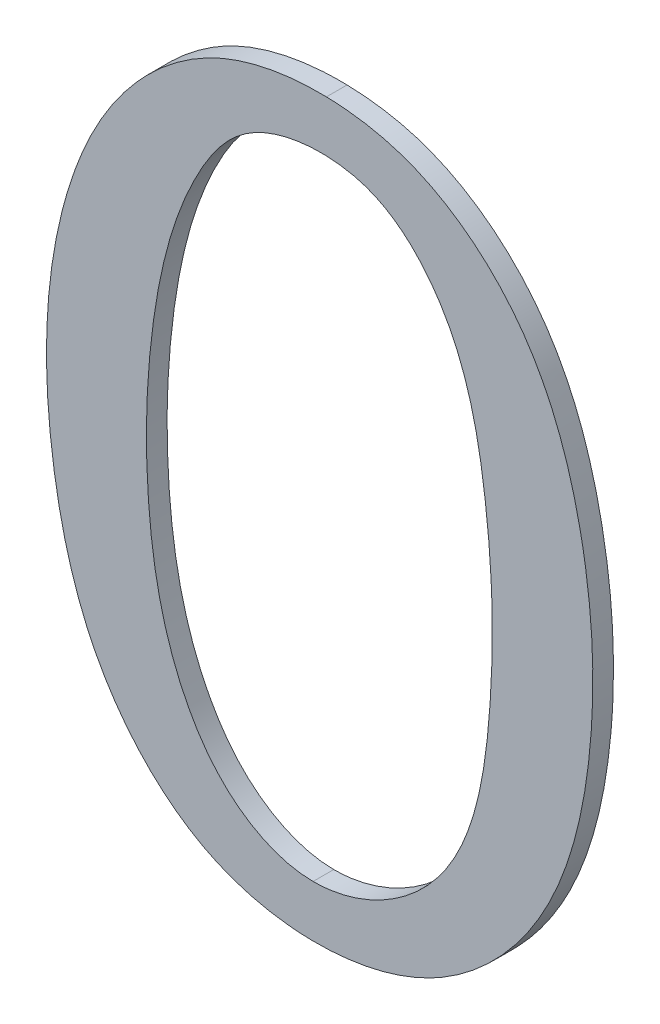
ISO-10303-21;
HEADER;
FILE_DESCRIPTION(('STEP AP214'),'2;1');
FILE_NAME('part.step','',(''),(''),'','','');
FILE_SCHEMA(('AUTOMOTIVE_DESIGN { 1 0 10303 214 1 1 1 1 }'));
ENDSEC;
DATA;
#1=APPLICATION_CONTEXT('core data for automotive mechanical design processes');
#2=APPLICATION_PROTOCOL_DEFINITION('international standard','automotive_design',2000,#1);
#3=PRODUCT_CONTEXT('',#1,'mechanical');
#4=PRODUCT('Part','Part','',(#3));
#5=PRODUCT_RELATED_PRODUCT_CATEGORY('part','',(#4));
#6=PRODUCT_DEFINITION_FORMATION('','',#4);
#7=PRODUCT_DEFINITION_CONTEXT('part definition',#1,'design');
#8=PRODUCT_DEFINITION('design','',#6,#7);
#9=PRODUCT_DEFINITION_SHAPE('','',#8);
#10=(LENGTH_UNIT() NAMED_UNIT(*) SI_UNIT(.MILLI.,.METRE.));
#11=(NAMED_UNIT(*) PLANE_ANGLE_UNIT() SI_UNIT($,.RADIAN.));
#12=(NAMED_UNIT(*) SI_UNIT($,.STERADIAN.) SOLID_ANGLE_UNIT());
#13=UNCERTAINTY_MEASURE_WITH_UNIT(LENGTH_MEASURE(1.E-05),#10,'distance_accuracy_value','');
#14=(GEOMETRIC_REPRESENTATION_CONTEXT(3) GLOBAL_UNCERTAINTY_ASSIGNED_CONTEXT((#13)) GLOBAL_UNIT_ASSIGNED_CONTEXT((#10,
#11,#12)) REPRESENTATION_CONTEXT('',''));
#15=CARTESIAN_POINT('',(0.,0.,0.));
#16=DIRECTION('',(0.,0.,1.));
#17=DIRECTION('',(1.,0.,0.));
#18=AXIS2_PLACEMENT_3D('',#15,#16,#17);
#19=CARTESIAN_POINT('',(0.,0.,0.));
#20=DIRECTION('',(0.,0.,1.));
#21=DIRECTION('',(1.,0.,0.));
#22=AXIS2_PLACEMENT_3D('',#19,#20,#21);
#23=PLANE('',#22);
#24=CARTESIAN_POINT('',(5.34232767395602,-2.83286261609844,0.));
#25=CARTESIAN_POINT('',(5.35965250410576,-2.83339807708916,0.));
#26=CARTESIAN_POINT('',(5.37704971181507,-2.83510172528794,0.));
#27=CARTESIAN_POINT('',(5.4111990705339,-2.84122313334333,0.));
#28=CARTESIAN_POINT('',(5.42795532083175,-2.84561867790736,0.));
#29=CARTESIAN_POINT('',(5.45232899603766,-2.85456008389062,0.));
#30=CARTESIAN_POINT('',(5.46036770756896,-2.85795649626895,0.));
#31=CARTESIAN_POINT('',(5.476074589901,-2.86551998855672,0.));
#32=CARTESIAN_POINT('',(5.48374264462424,-2.86968730794178,0.));
#33=CARTESIAN_POINT('',(5.50616232965964,-2.88319161529785,0.));
#34=CARTESIAN_POINT('',(5.520317116627,-2.8935262078646,0.));
#35=CARTESIAN_POINT('',(5.5515973920405,-2.92007799868785,0.));
#36=CARTESIAN_POINT('',(5.56803540477082,-2.93708942730186,0.));
#37=CARTESIAN_POINT('',(5.59809647927283,-2.97341480721425,0.));
#38=CARTESIAN_POINT('',(5.61171579114012,-2.99273177256757,0.));
#39=CARTESIAN_POINT('',(5.64197069888521,-3.04241743211644,0.));
#40=CARTESIAN_POINT('',(5.65705076118254,-3.07373884476934,0.));
#41=CARTESIAN_POINT('',(5.67583718818536,-3.12216303274755,0.));
#42=CARTESIAN_POINT('',(5.68146792308121,-3.13857971332396,0.));
#43=CARTESIAN_POINT('',(5.69164008808122,-3.17175360809558,0.));
#44=CARTESIAN_POINT('',(5.69618133489874,-3.18851087907532,0.));
#45=CARTESIAN_POINT('',(5.70626629905123,-3.23015254175063,0.));
#46=CARTESIAN_POINT('',(5.71128117329186,-3.25516236325165,0.));
#47=CARTESIAN_POINT('',(5.71996401178217,-3.30542085830458,0.));
#48=CARTESIAN_POINT('',(5.72363092190422,-3.3306697030169,0.));
#49=CARTESIAN_POINT('',(5.7301436295079,-3.38131691025709,0.));
#50=CARTESIAN_POINT('',(5.73298796562833,-3.40671545807686,0.));
#51=CARTESIAN_POINT('',(5.73777265407456,-3.45758675585848,0.));
#52=CARTESIAN_POINT('',(5.73971338421376,-3.48305947031898,0.));
#53=CARTESIAN_POINT('',(5.74416420823476,-3.55970108365071,0.));
#54=CARTESIAN_POINT('',(5.74528518756731,-3.61095784753678,0.));
#55=CARTESIAN_POINT('',(5.74385664847435,-3.71334004951881,0.));
#56=CARTESIAN_POINT('',(5.74131227623012,-3.76446557097506,0.));
#57=CARTESIAN_POINT('',(5.73420892416731,-3.8480146863933,0.));
#58=CARTESIAN_POINT('',(5.7307089107472,-3.88052643677705,0.));
#59=CARTESIAN_POINT('',(5.7210585493977,-3.94516365138298,0.));
#60=CARTESIAN_POINT('',(5.7149105426121,-3.97728943112015,0.));
#61=CARTESIAN_POINT('',(5.69856966185276,-4.04111019566887,0.));
#62=CARTESIAN_POINT('',(5.6883131733052,-4.07278988464719,0.));
#63=CARTESIAN_POINT('',(5.66230402835909,-4.13380992027127,0.));
#64=CARTESIAN_POINT('',(5.64657362524484,-4.16315915647873,0.));
#65=CARTESIAN_POINT('',(5.61386152995419,-4.21040812792149,0.));
#66=CARTESIAN_POINT('',(5.59829617285056,-4.22928936365041,0.));
#67=CARTESIAN_POINT('',(5.56423094893627,-4.26429186894457,0.));
#68=CARTESIAN_POINT('',(5.5457231977742,-4.28040547398632,0.));
#69=CARTESIAN_POINT('',(5.50615519222243,-4.30930061848974,0.));
#70=CARTESIAN_POINT('',(5.48508577512532,-4.32206964897589,0.));
#71=CARTESIAN_POINT('',(5.44105019212628,-4.34357377291139,0.));
#72=CARTESIAN_POINT('',(5.41809255975773,-4.35232595341397,0.));
#73=CARTESIAN_POINT('',(5.38090900946093,-4.36229576696,0.));
#74=CARTESIAN_POINT('',(5.36711355095475,-4.36513467126127,0.));
#75=CARTESIAN_POINT('',(5.33922936230977,-4.36896438584067,0.));
#76=CARTESIAN_POINT('',(5.32513984886992,-4.36994937914,0.));
#77=CARTESIAN_POINT('',(5.31101387814308,-4.36987614177689,0.));
#78=B_SPLINE_CURVE_WITH_KNOTS('',3,(#24,#25,#26,#27,#28,#29,#30,#31,#32,#33,#34,#35,#36,#37,#38,
#39,#40,#41,#42,#43,#44,#45,#46,#47,#48,#49,#50,#51,#52,#53,#54,#55,#56,#57,#58,#59,#60,#61,#62,
#63,#64,#65,#66,#67,#68,#69,#70,#71,#72,#73,#74,#75,#76,#77),.UNSPECIFIED.,.F.,.F.,(4,2,2,2,2,2,
2,2,2,2,2,2,2,2,2,2,2,2,2,2,2,2,2,2,2,2,4),(0.,0.052137867624516,0.103851151586213,
0.129989069242186,0.156135120093292,0.208466340264049,0.279062544695469,0.349752072635564,
0.453409253182165,0.505450405952289,0.557500307574428,0.633963284089065,0.710485929199705,
0.787143698628143,0.863769387261464,1.01743008862034,1.17087525934468,1.2689224237519,
1.366883080074,1.4664230888628,1.56556307277849,1.638637674604,1.71191149177715,
1.78545556722667,1.85868383001286,1.90082600710375,1.94310019382734),.UNSPECIFIED.);
#79=CARTESIAN_POINT('',(5.34232767395602,-2.83286261609844,0.));
#80=VERTEX_POINT('',#79);
#81=CARTESIAN_POINT('',(5.311013878142,-4.36987614177709,0.));
#82=VERTEX_POINT('',#81);
#83=EDGE_CURVE('E138',#80,#82,#78,.T.);
#84=ORIENTED_EDGE('',*,*,#83,.F.);
#85=CARTESIAN_POINT('',(5.311013878142,-4.3698761417773,0.));
#86=CARTESIAN_POINT('',(5.30291670221246,-4.36984619367228,0.));
#87=CARTESIAN_POINT('',(5.29482338630007,-4.36944376805904,0.));
#88=CARTESIAN_POINT('',(5.27871786714708,-4.36789951209408,0.));
#89=CARTESIAN_POINT('',(5.27070557498836,-4.366758608733,0.));
#90=CARTESIAN_POINT('',(5.24697781314285,-4.36225551502085,0.));
#91=CARTESIAN_POINT('',(5.23145955605173,-4.35781232822025,0.));
#92=CARTESIAN_POINT('',(5.2014105494815,-4.34657187291025,0.));
#93=CARTESIAN_POINT('',(5.18687581888405,-4.33978487011298,0.));
#94=CARTESIAN_POINT('',(5.15888580310387,-4.32423136597145,0.));
#95=CARTESIAN_POINT('',(5.14543221299879,-4.31546183532495,0.));
#96=CARTESIAN_POINT('',(5.1176200419846,-4.29455747170972,0.));
#97=CARTESIAN_POINT('',(5.10350111742456,-4.28210350226958,0.));
#98=CARTESIAN_POINT('',(5.07719894476444,-4.25531116713174,0.));
#99=CARTESIAN_POINT('',(5.06501672058335,-4.24097181191556,0.));
#100=CARTESIAN_POINT('',(5.03437013953986,-4.20012223694831,0.));
#101=CARTESIAN_POINT('',(5.01769558737703,-4.17228076637607,0.));
#102=CARTESIAN_POINT('',(4.98861392396518,-4.11446274607157,0.));
#103=CARTESIAN_POINT('',(4.97621898657009,-4.08448039361722,0.));
#104=CARTESIAN_POINT('',(4.95652815637315,-4.02724575776886,0.));
#105=CARTESIAN_POINT('',(4.94877826757898,-4.00014687880876,0.));
#106=CARTESIAN_POINT('',(4.93568318043903,-3.94536111390727,0.));
#107=CARTESIAN_POINT('',(4.93034036048064,-3.91767367457435,0.));
#108=CARTESIAN_POINT('',(4.92158877005833,-3.86188417639266,0.));
#109=CARTESIAN_POINT('',(4.91818847702708,-3.83378084110092,0.));
#110=CARTESIAN_POINT('',(4.91284924402855,-3.77745168511571,0.));
#111=CARTESIAN_POINT('',(4.91090989585905,-3.7492259008542,0.));
#112=CARTESIAN_POINT('',(4.90767344060163,-3.67896111173154,0.));
#113=CARTESIAN_POINT('',(4.90714810323008,-3.63688419130675,0.));
#114=CARTESIAN_POINT('',(4.90902767606048,-3.55276396338984,0.));
#115=CARTESIAN_POINT('',(4.91143460742267,-3.51072069909343,0.));
#116=CARTESIAN_POINT('',(4.91721987927172,-3.44800411090417,0.));
#117=CARTESIAN_POINT('',(4.91949972523195,-3.42722458678206,0.));
#118=CARTESIAN_POINT('',(4.9247654771734,-3.38575551353774,0.));
#119=CARTESIAN_POINT('',(4.9277514345914,-3.36506597108211,0.));
#120=CARTESIAN_POINT('',(4.93795920970902,-3.30324409782523,0.));
#121=CARTESIAN_POINT('',(4.94643610425821,-3.26229598692576,0.));
#122=CARTESIAN_POINT('',(4.9640918165215,-3.19587695733548,0.));
#123=CARTESIAN_POINT('',(4.97196000827565,-3.17005827304511,0.));
#124=CARTESIAN_POINT('',(4.98986888013895,-3.11906951077831,0.));
#125=CARTESIAN_POINT('',(4.99991706875571,-3.09390201966651,0.));
#126=CARTESIAN_POINT('',(5.01676583561125,-3.05685998070211,0.));
#127=CARTESIAN_POINT('',(5.02270178564882,-3.04458969465929,0.));
#128=CARTESIAN_POINT('',(5.03517776887967,-3.02036162225824,0.));
#129=CARTESIAN_POINT('',(5.04171803245094,-3.00840395732551,0.));
#130=CARTESIAN_POINT('',(5.06251240379304,-2.97333204220982,0.));
#131=CARTESIAN_POINT('',(5.07800113193524,-2.95087327800004,0.));
#132=CARTESIAN_POINT('',(5.1067767474317,-2.91824103182998,0.));
#133=CARTESIAN_POINT('',(5.11849790972033,-2.90672927828529,0.));
#134=CARTESIAN_POINT('',(5.13753053150947,-2.89127355812206,0.));
#135=CARTESIAN_POINT('',(5.14411025442947,-2.88642703722683,0.));
#136=CARTESIAN_POINT('',(5.15772097837214,-2.87741578325302,0.));
#137=CARTESIAN_POINT('',(5.16475205036702,-2.8732511577662,0.));
#138=CARTESIAN_POINT('',(5.1863071727889,-2.86177800870462,0.));
#139=CARTESIAN_POINT('',(5.20135479116944,-2.85544141560667,0.));
#140=CARTESIAN_POINT('',(5.23230113316282,-2.84514765147505,0.));
#141=CARTESIAN_POINT('',(5.24820391777136,-2.84120317333334,0.));
#142=CARTESIAN_POINT('',(5.27722448260667,-2.83606877695639,0.));
#143=CARTESIAN_POINT('',(5.29027632996494,-2.83449019102828,0.));
#144=CARTESIAN_POINT('',(5.31633689571419,-2.832694731877,0.));
#145=CARTESIAN_POINT('',(5.32934462923345,-2.83246374184637,0.));
#146=CARTESIAN_POINT('',(5.34232767395601,-2.83286261609844,0.));
#147=B_SPLINE_CURVE_WITH_KNOTS('',3,(#85,#86,#87,#88,#89,#90,#91,#92,#93,#94,#95,#96,#97,#98,
#99,#100,#101,#102,#103,#104,#105,#106,#107,#108,#109,#110,#111,#112,#113,#114,#115,#116,#117,
#118,#119,#120,#121,#122,#123,#124,#125,#126,#127,#128,#129,#130,#131,#132,#133,#134,#135,#136,
#137,#138,#139,#140,#141,#142,#143,#144,#145,#146),.UNSPECIFIED.,.F.,.F.,(4,2,2,2,2,2,2,2,2,2,2,
2,2,2,2,2,2,2,2,2,2,2,2,2,2,2,2,2,2,2,4),(0.,0.0242782205944365,0.0485260243597884,
0.0966912248188331,0.144648086705547,0.192678727982405,0.248935764083242,0.305222444650456,
0.402023911731217,0.49909851581644,0.583522592802493,0.668029905934809,0.75290325634344,
0.83775288350734,0.963892257841661,1.09011862699897,1.15281963846279,1.21552521879754,
1.34074852929579,1.42164550325074,1.50282566183968,1.54369908562575,1.58458815608514,
1.66589460019869,1.71493291434543,1.73940989259421,1.76389072918912,1.81262025667425,
1.86160613760291,1.90097840990769,1.93993748485444),.UNSPECIFIED.);
#148=EDGE_CURVE('E71',#82,#80,#147,.T.);
#149=ORIENTED_EDGE('',*,*,#148,.F.);
#150=EDGE_LOOP('',(#84,#149));
#151=FACE_BOUND('',#150,.T.);
#152=CARTESIAN_POINT('',(5.30932134215068,-4.49477730436278,0.));
#153=CARTESIAN_POINT('',(5.27746495698278,-4.49435096279586,0.));
#154=CARTESIAN_POINT('',(5.24552896522171,-4.49158402711856,0.));
#155=CARTESIAN_POINT('',(5.1825948046107,-4.48106909508276,0.));
#156=CARTESIAN_POINT('',(5.15159421868579,-4.4733353415552,0.));
#157=CARTESIAN_POINT('',(5.10634688096876,-4.45773084679566,0.));
#158=CARTESIAN_POINT('',(5.09141348909682,-4.45182879340066,0.));
#159=CARTESIAN_POINT('',(5.06217421304207,-4.43863691701124,0.));
#160=CARTESIAN_POINT('',(5.04786824402135,-4.43134728235692,0.));
#161=CARTESIAN_POINT('',(5.00607535329526,-4.40751974109352,0.));
#162=CARTESIAN_POINT('',(4.97969343190333,-4.38901628613651,0.));
#163=CARTESIAN_POINT('',(4.9262446032902,-4.3447178174415,0.));
#164=CARTESIAN_POINT('',(4.89976749226012,-4.31822581724455,0.));
#165=CARTESIAN_POINT('',(4.85143355673646,-4.2613249849967,0.));
#166=CARTESIAN_POINT('',(4.82957905049907,-4.23091419990238,0.));
#167=CARTESIAN_POINT('',(4.79768964992027,-4.17860166210305,0.));
#168=CARTESIAN_POINT('',(4.78622467388253,-4.15755255449613,0.));
#169=CARTESIAN_POINT('',(4.76525717193682,-4.11449547136837,0.));
#170=CARTESIAN_POINT('',(4.75575498721632,-4.09248732994469,0.));
#171=CARTESIAN_POINT('',(4.73851617837803,-4.04771098519015,0.));
#172=CARTESIAN_POINT('',(4.73078585363418,-4.02494039008139,0.));
#173=CARTESIAN_POINT('',(4.71691675153425,-3.9789175476034,0.));
#174=CARTESIAN_POINT('',(4.71077847779909,-3.95566515032924,0.));
#175=CARTESIAN_POINT('',(4.70039349259138,-3.91112103015207,0.));
#176=CARTESIAN_POINT('',(4.69602100349475,-3.88985808986708,0.));
#177=CARTESIAN_POINT('',(4.68819101992742,-3.84716290618923,0.));
#178=CARTESIAN_POINT('',(4.68473375170762,-3.82573062227911,0.));
#179=CARTESIAN_POINT('',(4.6755784886361,-3.76123389614573,0.));
#180=CARTESIAN_POINT('',(4.67110090257376,-3.71798715154523,0.));
#181=CARTESIAN_POINT('',(4.66582322168683,-3.63126025034107,0.));
#182=CARTESIAN_POINT('',(4.6650234950917,-3.58778007080206,0.));
#183=CARTESIAN_POINT('',(4.66746095995977,-3.50096118495432,0.));
#184=CARTESIAN_POINT('',(4.67069384237628,-3.45762237716443,0.));
#185=CARTESIAN_POINT('',(4.67950422465183,-3.38769311288225,0.));
#186=CARTESIAN_POINT('',(4.6837434466716,-3.36093118171615,0.));
#187=CARTESIAN_POINT('',(4.69398021756146,-3.30774716438252,0.));
#188=CARTESIAN_POINT('',(4.69997812301773,-3.28132514827051,0.));
#189=CARTESIAN_POINT('',(4.72074612137933,-3.20293785077192,0.));
#190=CARTESIAN_POINT('',(4.73831482706716,-3.1516438345784,0.));
#191=CARTESIAN_POINT('',(4.77701088713393,-3.06514143627837,0.));
#192=CARTESIAN_POINT('',(4.79620613915258,-3.02907522342432,0.));
#193=CARTESIAN_POINT('',(4.84025070683379,-2.96048430103641,0.));
#194=CARTESIAN_POINT('',(4.86510041555151,-2.92795983793076,0.));
#195=CARTESIAN_POINT('',(4.91479280337211,-2.87388417319952,0.));
#196=CARTESIAN_POINT('',(4.93866222079414,-2.85143544129147,0.));
#197=CARTESIAN_POINT('',(4.98967294581522,-2.81067012702481,0.));
#198=CARTESIAN_POINT('',(5.01680518118381,-2.79234247590901,0.));
#199=CARTESIAN_POINT('',(5.05976166048695,-2.76879379417704,0.));
#200=CARTESIAN_POINT('',(5.07451141749242,-2.76158347215181,0.));
#201=CARTESIAN_POINT('',(5.10464205209066,-2.74862948160285,0.));
#202=CARTESIAN_POINT('',(5.12002303459589,-2.74288605803932,0.));
#203=CARTESIAN_POINT('',(5.1669066874104,-2.72774225091012,0.));
#204=CARTESIAN_POINT('',(5.19911045777493,-2.72044949444625,0.));
#205=CARTESIAN_POINT('',(5.25017215638491,-2.71301486344577,0.));
#206=CARTESIAN_POINT('',(5.2688147371796,-2.71114656594125,0.));
#207=CARTESIAN_POINT('',(5.3060859266874,-2.70897747609111,0.));
#208=CARTESIAN_POINT('',(5.32471401169537,-2.70866782799925,0.));
#209=CARTESIAN_POINT('',(5.343331226402,-2.70908050910889,0.));
#210=B_SPLINE_CURVE_WITH_KNOTS('',3,(#152,#153,#154,#155,#156,#157,#158,#159,#160,#161,#162,
#163,#164,#165,#166,#167,#168,#169,#170,#171,#172,#173,#174,#175,#176,#177,#178,#179,#180,#181,
#182,#183,#184,#185,#186,#187,#188,#189,#190,#191,#192,#193,#194,#195,#196,#197,#198,#199,#200,
#201,#202,#203,#204,#205,#206,#207,#208,#209),.UNSPECIFIED.,.F.,.F.,(4,2,2,2,2,2,2,2,2,2,2,2,2,
2,2,2,2,2,2,2,2,2,2,2,2,2,2,2,4),(0.,0.0956790372363705,0.19108492327995,0.239192527689201,
0.287293606975229,0.38343329689225,0.495249920259242,0.607122487880247,0.678933623747667,
0.750757231893793,0.822832360274086,0.894930260784665,0.960029403748666,1.02514462481321,
1.15542891161188,1.28572624226693,1.41588446282707,1.49711274011098,1.57835749843583,
1.74022494576417,1.86235946366376,1.98450247402837,2.08245563454828,2.1801424749548,
2.22932482330012,2.2785153793389,2.37702918687024,2.43318492417687,2.4890212395665),.UNSPECIFIED.);
#211=CARTESIAN_POINT('',(5.30932134215134,-4.49477730436292,0.));
#212=VERTEX_POINT('',#211);
#213=CARTESIAN_POINT('',(5.343331226402,-2.70908050910885,0.));
#214=VERTEX_POINT('',#213);
#215=EDGE_CURVE('E58',#212,#214,#210,.T.);
#216=ORIENTED_EDGE('',*,*,#215,.T.);
#217=CARTESIAN_POINT('',(5.343331226402,-2.7090805091088,0.));
#218=CARTESIAN_POINT('',(5.37597392774525,-2.70979193638637,0.));
#219=CARTESIAN_POINT('',(5.40874371075378,-2.71281059950533,0.));
#220=CARTESIAN_POINT('',(5.4732075037356,-2.72403713125319,0.));
#221=CARTESIAN_POINT('',(5.50490568920578,-2.73222159997853,0.));
#222=CARTESIAN_POINT('',(5.55099977737467,-2.74885956161985,0.));
#223=CARTESIAN_POINT('',(5.5661758179233,-2.75516401310623,0.));
#224=CARTESIAN_POINT('',(5.59588521226096,-2.76914157741641,0.));
#225=CARTESIAN_POINT('',(5.61041832247964,-2.77681520349557,0.));
#226=CARTESIAN_POINT('',(5.65295397443955,-2.80167524775793,0.));
#227=CARTESIAN_POINT('',(5.67989847626886,-2.82070294103465,0.));
#228=CARTESIAN_POINT('',(5.72959163984756,-2.86201572044596,0.));
#229=CARTESIAN_POINT('',(5.75245153069845,-2.88416860047614,0.));
#230=CARTESIAN_POINT('',(5.78410991581941,-2.91968858013789,0.));
#231=CARTESIAN_POINT('',(5.79422129492513,-2.93190603547688,0.));
#232=CARTESIAN_POINT('',(5.81351200999114,-2.95705612482525,0.));
#233=CARTESIAN_POINT('',(5.82269126953029,-2.96998881734031,0.));
#234=CARTESIAN_POINT('',(5.85641552764183,-3.02127720793525,0.));
#235=CARTESIAN_POINT('',(5.87756795022868,-3.06191625113113,0.));
#236=CARTESIAN_POINT('',(5.90426073385355,-3.12494323844761,0.));
#237=CARTESIAN_POINT('',(5.91233392350317,-3.14635752579339,0.));
#238=CARTESIAN_POINT('',(5.92700656222124,-3.18969870171662,0.));
#239=CARTESIAN_POINT('',(5.93360575842016,-3.21162567753619,0.));
#240=CARTESIAN_POINT('',(5.94479258817907,-3.25314196606688,0.));
#241=CARTESIAN_POINT('',(5.94952704555619,-3.272692790392,0.));
#242=CARTESIAN_POINT('',(5.95814894265935,-3.31198156133882,0.));
#243=CARTESIAN_POINT('',(5.96203624935503,-3.3317195368423,0.));
#244=CARTESIAN_POINT('',(5.97251049285066,-3.39115791554493,0.));
#245=CARTESIAN_POINT('',(5.9779077380937,-3.43107502255474,0.));
#246=CARTESIAN_POINT('',(5.98544410081129,-3.51127139098697,0.));
#247=CARTESIAN_POINT('',(5.98757835245391,-3.55155110334298,0.));
#248=CARTESIAN_POINT('',(5.98857651409187,-3.63213808323199,0.));
#249=CARTESIAN_POINT('',(5.98744160078298,-3.67244533563095,0.));
#250=CARTESIAN_POINT('',(5.9827728503376,-3.74158684611474,0.));
#251=CARTESIAN_POINT('',(5.97999920475844,-3.77047522456631,0.));
#252=CARTESIAN_POINT('',(5.97271467132332,-3.82804021701716,0.));
#253=CARTESIAN_POINT('',(5.96820369216176,-3.85671681980584,0.));
#254=CARTESIAN_POINT('',(5.95712370622989,-3.91355730198847,0.));
#255=CARTESIAN_POINT('',(5.95056328786924,-3.94172281135031,0.));
#256=CARTESIAN_POINT('',(5.93508511208833,-3.99738688657378,0.));
#257=CARTESIAN_POINT('',(5.92616852984518,-4.02488577747873,0.));
#258=CARTESIAN_POINT('',(5.90111036094807,-4.09090093234225,0.));
#259=CARTESIAN_POINT('',(5.88351854899114,-4.12888987810873,0.));
#260=CARTESIAN_POINT('',(5.84222116222749,-4.20146795596025,0.));
#261=CARTESIAN_POINT('',(5.81851094854583,-4.23605448078114,0.));
#262=CARTESIAN_POINT('',(5.76947784230932,-4.29570462780551,0.));
#263=CARTESIAN_POINT('',(5.74494122427127,-4.32141737372351,0.));
#264=CARTESIAN_POINT('',(5.69202008540271,-4.368506434169,0.));
#265=CARTESIAN_POINT('',(5.66364401413106,-4.38989202065283,0.));
#266=CARTESIAN_POINT('',(5.61840303120596,-4.41783700346917,0.));
#267=CARTESIAN_POINT('',(5.6028109001932,-4.42648847592322,0.));
#268=CARTESIAN_POINT('',(5.57085437896406,-4.44222301622757,0.));
#269=CARTESIAN_POINT('',(5.55448989607198,-4.44930589527655,0.));
#270=CARTESIAN_POINT('',(5.50447660738436,-4.46823261866415,0.));
#271=CARTESIAN_POINT('',(5.46991587632785,-4.47774973042622,0.));
#272=CARTESIAN_POINT('',(5.41411674287599,-4.48807426693424,0.));
#273=CARTESIAN_POINT('',(5.39320599567879,-4.4908516194525,0.));
#274=CARTESIAN_POINT('',(5.35130240738278,-4.49433715591504,0.));
#275=CARTESIAN_POINT('',(5.33031030896768,-4.49505420964849,0.));
#276=CARTESIAN_POINT('',(5.30932134215067,-4.49477730436305,0.));
#277=B_SPLINE_CURVE_WITH_KNOTS('',3,(#217,#218,#219,#220,#221,#222,#223,#224,#225,#226,#227,
#228,#229,#230,#231,#232,#233,#234,#235,#236,#237,#238,#239,#240,#241,#242,#243,#244,#245,#246,
#247,#248,#249,#250,#251,#252,#253,#254,#255,#256,#257,#258,#259,#260,#261,#262,#263,#264,#265,
#266,#267,#268,#269,#270,#271,#272,#273,#274,#275,#276),.UNSPECIFIED.,.F.,.F.,(4,2,2,2,2,2,2,2,
2,2,2,2,2,2,2,2,2,2,2,2,2,2,2,2,2,2,2,2,2,4),(0.,0.0981639049071688,0.195886310279702,
0.245113999266006,0.294360180899364,0.392834733948634,0.487972869232006,0.535511245648746,
0.583053516424708,0.719568862951922,0.788197611262888,0.856838124085734,0.917165908728499,
0.977503159990561,1.09820161146603,1.21907987558557,1.33991463649507,1.42693495134862,
1.51395984018068,1.60062482561993,1.6872466667358,1.8123157420149,1.93747992272407,
2.04371375269017,2.14971748322988,2.20313477453988,2.25655849184947,2.36343328909855,
2.42663111069884,2.48955644879853),.UNSPECIFIED.);
#278=EDGE_CURVE('E21',#214,#212,#277,.T.);
#279=ORIENTED_EDGE('',*,*,#278,.T.);
#280=EDGE_LOOP('',(#216,#279));
#281=FACE_BOUND('',#280,.T.);
#282=ADVANCED_FACE('F17',(#151,#281),#23,.F.);
#283=CARTESIAN_POINT('',(5.318484420163,-2.708959918614,0.));
#284=CARTESIAN_POINT('',(5.326769981109,-2.708852941025,0.));
#285=CARTESIAN_POINT('',(5.405938880114,-2.709248281172,0.));
#286=CARTESIAN_POINT('',(5.594909323519,-2.742091683031,0.));
#287=CARTESIAN_POINT('',(5.853808507774,-2.9529344706,0.));
#288=CARTESIAN_POINT('',(5.982565346785,-3.334035594528,0.));
#289=CARTESIAN_POINT('',(6.001808238156,-3.758056760647,0.));
#290=CARTESIAN_POINT('',(5.901925916774,-4.170554099048,0.));
#291=CARTESIAN_POINT('',(5.634644647054,-4.446297922852,0.));
#292=CARTESIAN_POINT('',(5.411407868027,-4.495444757753,0.));
#293=CARTESIAN_POINT('',(5.30415632821,-4.494767310763,0.));
#294=CARTESIAN_POINT('',(5.292717126077,-4.494394321429,0.));
#295=CARTESIAN_POINT('',(5.284426120858,-4.493963093199,0.));
#296=(BOUNDED_CURVE() B_SPLINE_CURVE(3,(#283,#284,#285,#286,#287,#288,#289,#290,#291,#292,#293,
#294,#295),.UNSPECIFIED.,.F.,.F.) B_SPLINE_CURVE_WITH_KNOTS((4,1,1,1,1,1,1,1,1,1,4),(0.,
0.009748419186851,0.09315231256893,0.2246422952682,0.3831163361497,0.5569760037441,
0.7276787228693,0.8740886174428,0.9865664871314,0.9902515808132,1.),
.UNSPECIFIED.) CURVE() GEOMETRIC_REPRESENTATION_ITEM() RATIONAL_B_SPLINE_CURVE((1.,1.,1.,1.,1.,
1.,1.,1.,1.,1.,1.,1.,1.)) REPRESENTATION_ITEM(''));
#297=DIRECTION('',(0.,0.,1.));
#298=VECTOR('',#297,1.);
#299=SURFACE_OF_LINEAR_EXTRUSION('',#296,#298);
#300=CARTESIAN_POINT('',(5.30932134479917,-4.49477730439887,0.05));
#301=CARTESIAN_POINT('',(5.34323144727325,-4.4952201224871,0.05));
#302=CARTESIAN_POINT('',(5.37723107599895,-4.49306392179999,0.05));
#303=CARTESIAN_POINT('',(5.4444020534631,-4.48333548852445,0.05));
#304=CARTESIAN_POINT('',(5.47757418881149,-4.47576861946337,0.05));
#305=CARTESIAN_POINT('',(5.5423274414833,-4.45494678430982,0.05));
#306=CARTESIAN_POINT('',(5.57389904588452,-4.44166145514167,0.05));
#307=CARTESIAN_POINT('',(5.63397785554225,-4.40945850947483,0.05));
#308=CARTESIAN_POINT('',(5.66248746481787,-4.39054535611487,0.05));
#309=CARTESIAN_POINT('',(5.71444292960377,-4.34960711539009,0.05));
#310=CARTESIAN_POINT('',(5.738087488319,-4.32782892692252,0.05));
#311=CARTESIAN_POINT('',(5.78213617233443,-4.28118407320183,0.05));
#312=CARTESIAN_POINT('',(5.80253776680906,-4.2563150225305,0.05));
#313=CARTESIAN_POINT('',(5.8323553740348,-4.21470087528702,0.05));
#314=CARTESIAN_POINT('',(5.84287905938639,-4.1987341119461,0.05));
#315=CARTESIAN_POINT('',(5.86266232744753,-4.16603480182207,0.05));
#316=CARTESIAN_POINT('',(5.87192185438774,-4.14930222129778,0.05));
#317=CARTESIAN_POINT('',(5.89781151527908,-4.09815992489033,0.05));
#318=CARTESIAN_POINT('',(5.91256526277769,-4.06278790930124,0.05));
#319=CARTESIAN_POINT('',(5.93566371075392,-3.99601173627653,0.05));
#320=CARTESIAN_POINT('',(5.9446402538335,-3.96481659329245,0.05));
#321=CARTESIAN_POINT('',(5.95978735828059,-3.90173041026946,0.05));
#322=CARTESIAN_POINT('',(5.96595532285429,-3.86983875466881,0.05));
#323=CARTESIAN_POINT('',(5.97594981933934,-3.80556975712407,0.05));
#324=CARTESIAN_POINT('',(5.97976659998393,-3.7731909555064,0.05));
#325=CARTESIAN_POINT('',(5.98535578638688,-3.70827295010024,0.05));
#326=CARTESIAN_POINT('',(5.98712903387282,-3.6757338179021,0.05));
#327=CARTESIAN_POINT('',(5.98860257689993,-3.60817739882399,0.05));
#328=CARTESIAN_POINT('',(5.9881383971701,-3.57315629114644,0.05));
#329=CARTESIAN_POINT('',(5.9847474387213,-3.5032218709621,0.05));
#330=CARTESIAN_POINT('',(5.98181988685521,-3.4683085957526,0.05));
#331=CARTESIAN_POINT('',(5.97351155574408,-3.39887236233317,0.05));
#332=CARTESIAN_POINT('',(5.96813724154341,-3.36434861968366,0.05));
#333=CARTESIAN_POINT('',(5.95501390907931,-3.29575768170759,0.05));
#334=CARTESIAN_POINT('',(5.9472659302525,-3.26169029334372,0.05));
#335=CARTESIAN_POINT('',(5.93251541988765,-3.20804560879422,0.05));
#336=CARTESIAN_POINT('',(5.92648755822459,-3.188201284399,0.05));
#337=CARTESIAN_POINT('',(5.9132141677012,-3.14892287456306,0.05));
#338=CARTESIAN_POINT('',(5.90596882549022,-3.12948872675232,0.05));
#339=CARTESIAN_POINT('',(5.89012455149613,-3.09120425922815,0.05));
#340=CARTESIAN_POINT('',(5.88152736198922,-3.07235322490785,0.05));
#341=CARTESIAN_POINT('',(5.86284555147877,-3.0354003666982,0.05));
#342=CARTESIAN_POINT('',(5.85276106270741,-3.01729847638731,0.05));
#343=CARTESIAN_POINT('',(5.83085031921521,-2.98181905855007,0.05));
#344=CARTESIAN_POINT('',(5.81900170236527,-2.96445518126297,0.05));
#345=CARTESIAN_POINT('',(5.79366513372994,-2.93097995525611,0.05));
#346=CARTESIAN_POINT('',(5.78017700963279,-2.91486873848288,0.05));
#347=CARTESIAN_POINT('',(5.73745110549779,-2.86860189955173,0.05));
#348=CARTESIAN_POINT('',(5.70592145486889,-2.84046392236138,0.05));
#349=CARTESIAN_POINT('',(5.65714583849467,-2.80527273723559,0.05));
#350=CARTESIAN_POINT('',(5.64192529953212,-2.79530438937917,0.05));
#351=CARTESIAN_POINT('',(5.61060295618019,-2.77685555227623,0.05));
#352=CARTESIAN_POINT('',(5.59450154713037,-2.76837440263822,0.05));
#353=CARTESIAN_POINT('',(5.56152399176999,-2.75311299914507,0.05));
#354=CARTESIAN_POINT('',(5.54464840463317,-2.74633153982555,0.05));
#355=CARTESIAN_POINT('',(5.51028956128192,-2.73455385726219,0.05));
#356=CARTESIAN_POINT('',(5.4928063404956,-2.72955753012709,0.05));
#357=CARTESIAN_POINT('',(5.453530143218,-2.72031532795702,0.05));
#358=CARTESIAN_POINT('',(5.43164129551391,-2.71648164821862,0.05));
#359=CARTESIAN_POINT('',(5.38760968995312,-2.71111301724461,0.05));
#360=CARTESIAN_POINT('',(5.36546731879719,-2.70957494027922,0.05));
#361=CARTESIAN_POINT('',(5.343331226402,-2.7090805091088,0.05));
#362=B_SPLINE_CURVE_WITH_KNOTS('',3,(#300,#301,#302,#303,#304,#305,#306,#307,#308,#309,#310,
#311,#312,#313,#314,#315,#316,#317,#318,#319,#320,#321,#322,#323,#324,#325,#326,#327,#328,#329,
#330,#331,#332,#333,#334,#335,#336,#337,#338,#339,#340,#341,#342,#343,#344,#345,#346,#347,#348,
#349,#350,#351,#352,#353,#354,#355,#356,#357,#358,#359,#360,#361),.UNSPECIFIED.,.F.,.F.,(4,2,2,
2,2,2,2,2,2,2,2,2,2,2,2,2,2,2,2,2,2,2,2,2,2,2,2,2,2,2,4),(0.,0.101724886400687,
0.203349073750153,0.305519639113005,0.407609393213855,0.503724496128384,0.599914243344581,
0.6572322161949,0.714552716856853,0.829129216169192,0.926376651871073,1.02371382026524,
1.12145201236849,1.21914993188319,1.32413463870275,1.42915230802605,1.53389408688632,
1.63859006433298,1.70077615941207,1.76295272955679,1.82504981289493,1.88714137865684,
1.95010026818933,2.01306578041418,2.13882609075463,2.19335158689957,2.24785280930322,
2.30231526794846,2.35677455646661,2.42331198832006,2.48975873881608),.UNSPECIFIED.);
#363=CARTESIAN_POINT('',(5.30932134347559,-4.49477730438084,0.05));
#364=VERTEX_POINT('',#363);
#365=CARTESIAN_POINT('',(5.343331226402,-2.70908050910889,0.05));
#366=VERTEX_POINT('',#365);
#367=EDGE_CURVE('E67',#364,#366,#362,.T.);
#368=ORIENTED_EDGE('',*,*,#367,.F.);
#369=DIRECTION('',(0.,0.,1.));
#370=VECTOR('',#369,1.);
#371=CARTESIAN_POINT('',(5.309321342152,-4.4947773043628,0.));
#372=LINE('',#371,#370);
#373=EDGE_CURVE('E64',#364,#212,#372,.F.);
#374=ORIENTED_EDGE('',*,*,#373,.T.);
#375=ORIENTED_EDGE('',*,*,#278,.F.);
#376=DIRECTION('',(0.,0.,1.));
#377=VECTOR('',#376,1.);
#378=CARTESIAN_POINT('',(5.343331226402,-2.70908050910889,0.));
#379=LINE('',#378,#377);
#380=EDGE_CURVE('E72',#214,#366,#379,.T.);
#381=ORIENTED_EDGE('',*,*,#380,.T.);
#382=EDGE_LOOP('',(#368,#374,#375,#381));
#383=FACE_BOUND('',#382,.T.);
#384=ADVANCED_FACE('F65',(#383),#299,.F.);
#385=CARTESIAN_POINT('',(5.334227875089,-4.494640641541,0.));
#386=CARTESIAN_POINT('',(5.329066171962,-4.49476713369,0.));
#387=CARTESIAN_POINT('',(5.320763769846,-4.494872210528,0.));
#388=CARTESIAN_POINT('',(5.224585517054,-4.494264707195,0.));
#389=CARTESIAN_POINT('',(5.012196855075,-4.448417203236,0.));
#390=CARTESIAN_POINT('',(4.768822484602,-4.1900111665,0.));
#391=CARTESIAN_POINT('',(4.657205728995,-3.775650756874,0.));
#392=CARTESIAN_POINT('',(4.657787636286,-3.335167759064,0.));
#393=CARTESIAN_POINT('',(4.814004840571,-2.951284519039,0.));
#394=CARTESIAN_POINT('',(5.063675840772,-2.73867649208,0.));
#395=CARTESIAN_POINT('',(5.260894613191,-2.705634624303,0.));
#396=CARTESIAN_POINT('',(5.359874760271,-2.709597723471,0.));
#397=CARTESIAN_POINT('',(5.368126639683,-2.710078269791,0.));
#398=(BOUNDED_CURVE() B_SPLINE_CURVE(3,(#385,#386,#387,#388,#389,#390,#391,#392,#393,#394,#395,
#396,#397),.UNSPECIFIED.,.F.,.F.) B_SPLINE_CURVE_WITH_KNOTS((4,1,1,1,1,1,1,1,1,1,4),(0.,
0.006063325505097,0.009748419186851,0.1129115423571,0.2560098104691,0.404798334321,
0.6162630215134,0.770394385798,0.88328772344,0.9902515808132,1.),
.UNSPECIFIED.) CURVE() GEOMETRIC_REPRESENTATION_ITEM() RATIONAL_B_SPLINE_CURVE((1.,1.,1.,1.,1.,
1.,1.,1.,1.,1.,1.,1.,1.)) REPRESENTATION_ITEM(''));
#399=DIRECTION('',(0.,0.,1.));
#400=VECTOR('',#399,1.);
#401=SURFACE_OF_LINEAR_EXTRUSION('',#398,#400);
#402=CARTESIAN_POINT('',(5.343331226402,-2.7090805091089,0.05));
#403=CARTESIAN_POINT('',(5.3267158150912,-2.70870865259905,0.05));
#404=CARTESIAN_POINT('',(5.31008222006602,-2.70891709714732,0.05));
#405=CARTESIAN_POINT('',(5.27685548278433,-2.71055810116155,0.05));
#406=CARTESIAN_POINT('',(5.26026241716588,-2.71199219166967,0.05));
#407=CARTESIAN_POINT('',(5.22724896635482,-2.71614756573479,0.05));
#408=CARTESIAN_POINT('',(5.21082845243448,-2.7188678079943,0.05));
#409=CARTESIAN_POINT('',(5.17827486672239,-2.72566812531292,0.05));
#410=CARTESIAN_POINT('',(5.16214170184781,-2.72974775125652,0.05));
#411=CARTESIAN_POINT('',(5.130149465807,-2.73937736563909,0.05));
#412=CARTESIAN_POINT('',(5.11429441975392,-2.7449408707117,0.05));
#413=CARTESIAN_POINT('',(5.08320846250219,-2.75759968259168,0.05));
#414=CARTESIAN_POINT('',(5.06797745557472,-2.76469475339922,0.05));
#415=CARTESIAN_POINT('',(5.03829900796577,-2.78031948411164,0.05));
#416=CARTESIAN_POINT('',(5.0238505281153,-2.78884717654101,0.05));
#417=CARTESIAN_POINT('',(4.99577284601331,-2.80715651297368,0.05));
#418=CARTESIAN_POINT('',(4.98214396808597,-2.81693864863783,0.05));
#419=CARTESIAN_POINT('',(4.93975050618889,-2.85013013380248,0.05));
#420=CARTESIAN_POINT('',(4.91264285626313,-2.87569676077498,0.05));
#421=CARTESIAN_POINT('',(4.86295513838579,-2.93092959087071,0.05));
#422=CARTESIAN_POINT('',(4.84038584144448,-2.96060527098231,0.05));
#423=CARTESIAN_POINT('',(4.79355739520343,-3.03279602342212,0.05));
#424=CARTESIAN_POINT('',(4.77100136531242,-3.07641280996149,0.05));
#425=CARTESIAN_POINT('',(4.73307009172259,-3.16672178901038,0.05));
#426=CARTESIAN_POINT('',(4.71772028643541,-3.21342422221236,0.05));
#427=CARTESIAN_POINT('',(4.69640698248818,-3.29559887236457,0.05));
#428=CARTESIAN_POINT('',(4.68902996211066,-3.33072072357095,0.05));
#429=CARTESIAN_POINT('',(4.67733457219548,-3.40140258881391,0.05));
#430=CARTESIAN_POINT('',(4.67301043608877,-3.43696164698963,0.05));
#431=CARTESIAN_POINT('',(4.66722517357079,-3.50853514453562,0.05));
#432=CARTESIAN_POINT('',(4.66578263396144,-3.544551041822,0.05));
#433=CARTESIAN_POINT('',(4.66560000252711,-3.61660331259932,0.05));
#434=CARTESIAN_POINT('',(4.66686135952253,-3.65263968671899,0.05));
#435=CARTESIAN_POINT('',(4.67199031201174,-3.7260175126856,0.05));
#436=CARTESIAN_POINT('',(4.67596321189244,-3.76335151860489,0.05));
#437=CARTESIAN_POINT('',(4.68375505044269,-3.81910079088683,0.05));
#438=CARTESIAN_POINT('',(4.68665925785205,-3.83764921901804,0.05));
#439=CARTESIAN_POINT('',(4.69312616283514,-3.87463032861654,0.05));
#440=CARTESIAN_POINT('',(4.69668883805796,-3.89306301399061,0.05));
#441=CARTESIAN_POINT('',(4.70849917551354,-3.94783981093192,0.05));
#442=CARTESIAN_POINT('',(4.71790580906562,-3.9839495740218,0.05));
#443=CARTESIAN_POINT('',(4.74066876548396,-4.05485973435471,0.05));
#444=CARTESIAN_POINT('',(4.75401731540776,-4.08966255789232,0.05));
#445=CARTESIAN_POINT('',(4.78509900582569,-4.15639247021997,0.05));
#446=CARTESIAN_POINT('',(4.80273059435891,-4.18836560731283,0.05));
#447=CARTESIAN_POINT('',(4.83262277416491,-4.23406867975643,0.05));
#448=CARTESIAN_POINT('',(4.84317018120664,-4.24893724331987,0.05));
#449=CARTESIAN_POINT('',(4.86539520407638,-4.27784496499025,0.05));
#450=CARTESIAN_POINT('',(4.87707482318476,-4.29188257950474,0.05));
#451=CARTESIAN_POINT('',(4.91394293585139,-4.33269631954988,0.05));
#452=CARTESIAN_POINT('',(4.94083720963294,-4.35798172752604,0.05));
#453=CARTESIAN_POINT('',(4.99894179801699,-4.402997200575,0.05));
#454=CARTESIAN_POINT('',(5.03014367576358,-4.42273790157021,0.05));
#455=CARTESIAN_POINT('',(5.09231384437836,-4.45306280404129,0.05));
#456=CARTESIAN_POINT('',(5.12289809911768,-4.46443776860719,0.05));
#457=CARTESIAN_POINT('',(5.18557568162961,-4.48180379192283,0.05));
#458=CARTESIAN_POINT('',(5.2176718333457,-4.48778431838074,0.05));
#459=CARTESIAN_POINT('',(5.26972994231591,-4.49334155479224,0.05));
#460=CARTESIAN_POINT('',(5.28953178611338,-4.49450754032633,0.05));
#461=CARTESIAN_POINT('',(5.30932134479917,-4.4947773043986,0.05));
#462=B_SPLINE_CURVE_WITH_KNOTS('',3,(#402,#403,#404,#405,#406,#407,#408,#409,#410,#411,#412,
#413,#414,#415,#416,#417,#418,#419,#420,#421,#422,#423,#424,#425,#426,#427,#428,#429,#430,#431,
#432,#433,#434,#435,#436,#437,#438,#439,#440,#441,#442,#443,#444,#445,#446,#447,#448,#449,#450,
#451,#452,#453,#454,#455,#456,#457,#458,#459,#460,#461),.UNSPECIFIED.,.F.,.F.,(4,2,2,2,2,2,2,2,
2,2,2,2,2,2,2,2,2,2,2,2,2,2,2,2,2,2,2,2,2,4),(0.,0.0498563133535357,0.0997749969804064,
0.149653334339796,0.199515209120509,0.249847778632961,0.300172597900259,0.350428860797622,
0.400704881456939,0.511863020695709,0.623281939559646,0.769762086522567,0.916755499791216,
1.02429397187089,1.13162876794826,1.23965368515633,1.34773649948403,1.46027528189458,
1.51658928056501,1.57290136807502,1.68466020070262,1.79620011455752,1.90531690150754,
1.95995738896342,2.01469638328948,2.12485062376893,2.23479209911966,2.33211798780245,
2.4296334902427,2.4890378004824),.UNSPECIFIED.);
#463=EDGE_CURVE('E141',#366,#364,#462,.T.);
#464=ORIENTED_EDGE('',*,*,#463,.F.);
#465=ORIENTED_EDGE('',*,*,#380,.F.);
#466=ORIENTED_EDGE('',*,*,#215,.F.);
#467=ORIENTED_EDGE('',*,*,#373,.F.);
#468=EDGE_LOOP('',(#464,#465,#466,#467));
#469=FACE_BOUND('',#468,.T.);
#470=ADVANCED_FACE('F74',(#469),#401,.F.);
#471=CARTESIAN_POINT('',(5.329982993363,-4.369348995258,0.));
#472=CARTESIAN_POINT('',(5.323657573015,-4.369731463275,0.));
#473=CARTESIAN_POINT('',(5.305636837685,-4.370241142738,0.));
#474=CARTESIAN_POINT('',(5.228921077276,-4.365025698736,0.));
#475=CARTESIAN_POINT('',(5.096284434473,-4.298325070404,0.));
#476=CARTESIAN_POINT('',(4.95426522382,-4.083008476452,0.));
#477=CARTESIAN_POINT('',(4.899702814038,-3.765373346578,0.));
#478=CARTESIAN_POINT('',(4.911022213563,-3.392855690915,0.));
#479=CARTESIAN_POINT('',(4.98438073817,-3.086612812449,0.));
#480=CARTESIAN_POINT('',(5.133725156851,-2.861963081252,0.));
#481=CARTESIAN_POINT('',(5.279759994678,-2.829196001796,0.));
#482=CARTESIAN_POINT('',(5.35518067318,-2.833423799559,0.));
#483=CARTESIAN_POINT('',(5.361563059374,-2.8339490079,0.));
#484=(BOUNDED_CURVE() B_SPLINE_CURVE(3,(#471,#472,#473,#474,#475,#476,#477,#478,#479,#480,#481,
#482,#483),.UNSPECIFIED.,.F.,.F.) B_SPLINE_CURVE_WITH_KNOTS((4,1,1,1,1,1,1,1,1,1,4),(0.,
0.009607594230695,0.02736699786479,0.1169883235018,0.2224908594858,0.4100257656214,
0.5985563116098,0.7899149957983,0.8870496491292,0.9903924057693,1.),
.UNSPECIFIED.) CURVE() GEOMETRIC_REPRESENTATION_ITEM() RATIONAL_B_SPLINE_CURVE((1.,1.,1.,1.,1.,
1.,1.,1.,1.,1.,1.,1.,1.)) REPRESENTATION_ITEM(''));
#485=DIRECTION('',(0.,0.,1.));
#486=VECTOR('',#485,1.);
#487=SURFACE_OF_LINEAR_EXTRUSION('',#484,#486);
#488=DIRECTION('',(0.,0.,1.));
#489=VECTOR('',#488,1.);
#490=CARTESIAN_POINT('',(5.311013878142,-4.36987614177688,0.));
#491=LINE('',#490,#489);
#492=CARTESIAN_POINT('',(5.311013878142,-4.36987614177709,0.05));
#493=VERTEX_POINT('',#492);
#494=EDGE_CURVE('E133',#82,#493,#491,.T.);
#495=ORIENTED_EDGE('',*,*,#494,.F.);
#496=ORIENTED_EDGE('',*,*,#148,.T.);
#497=DIRECTION('',(0.,0.,1.));
#498=VECTOR('',#497,1.);
#499=CARTESIAN_POINT('',(5.34232767395602,-2.83286261609844,0.));
#500=LINE('',#499,#498);
#501=CARTESIAN_POINT('',(5.34232767395602,-2.83286261609844,0.05));
#502=VERTEX_POINT('',#501);
#503=EDGE_CURVE('E39',#502,#80,#500,.F.);
#504=ORIENTED_EDGE('',*,*,#503,.F.);
#505=CARTESIAN_POINT('',(5.311013878142,-4.3698761417773,0.05));
#506=CARTESIAN_POINT('',(5.30291670221246,-4.36984619367228,0.05));
#507=CARTESIAN_POINT('',(5.29482338630007,-4.36944376805904,0.05));
#508=CARTESIAN_POINT('',(5.27871786714708,-4.36789951209408,0.05));
#509=CARTESIAN_POINT('',(5.27070557498836,-4.366758608733,0.05));
#510=CARTESIAN_POINT('',(5.24697781314285,-4.36225551502085,0.05));
#511=CARTESIAN_POINT('',(5.23145955605173,-4.35781232822025,0.05));
#512=CARTESIAN_POINT('',(5.2014105494815,-4.34657187291025,0.05));
#513=CARTESIAN_POINT('',(5.18687581888405,-4.33978487011298,0.05));
#514=CARTESIAN_POINT('',(5.15888580310387,-4.32423136597145,0.05));
#515=CARTESIAN_POINT('',(5.14543221299879,-4.31546183532495,0.05));
#516=CARTESIAN_POINT('',(5.1176200419846,-4.29455747170972,0.05));
#517=CARTESIAN_POINT('',(5.10350111742456,-4.28210350226958,0.05));
#518=CARTESIAN_POINT('',(5.07719894476444,-4.25531116713174,0.05));
#519=CARTESIAN_POINT('',(5.06501672058335,-4.24097181191556,0.05));
#520=CARTESIAN_POINT('',(5.03437013953986,-4.20012223694831,0.05));
#521=CARTESIAN_POINT('',(5.01769558737703,-4.17228076637607,0.05));
#522=CARTESIAN_POINT('',(4.98861392396518,-4.11446274607157,0.05));
#523=CARTESIAN_POINT('',(4.97621898657009,-4.08448039361722,0.05));
#524=CARTESIAN_POINT('',(4.95652815637315,-4.02724575776886,0.05));
#525=CARTESIAN_POINT('',(4.94877826757898,-4.00014687880876,0.05));
#526=CARTESIAN_POINT('',(4.93568318043903,-3.94536111390727,0.05));
#527=CARTESIAN_POINT('',(4.93034036048064,-3.91767367457435,0.05));
#528=CARTESIAN_POINT('',(4.92158877005833,-3.86188417639266,0.05));
#529=CARTESIAN_POINT('',(4.91818847702708,-3.83378084110092,0.05));
#530=CARTESIAN_POINT('',(4.91284924402855,-3.77745168511571,0.05));
#531=CARTESIAN_POINT('',(4.91090989585905,-3.7492259008542,0.05));
#532=CARTESIAN_POINT('',(4.90767344060163,-3.67896111173154,0.05));
#533=CARTESIAN_POINT('',(4.90714810323008,-3.63688419130675,0.05));
#534=CARTESIAN_POINT('',(4.90902767606048,-3.55276396338984,0.05));
#535=CARTESIAN_POINT('',(4.91143460742267,-3.51072069909343,0.05));
#536=CARTESIAN_POINT('',(4.91721987927172,-3.44800411090417,0.05));
#537=CARTESIAN_POINT('',(4.91949972523195,-3.42722458678206,0.05));
#538=CARTESIAN_POINT('',(4.9247654771734,-3.38575551353774,0.05));
#539=CARTESIAN_POINT('',(4.9277514345914,-3.36506597108211,0.05));
#540=CARTESIAN_POINT('',(4.93795920970902,-3.30324409782523,0.05));
#541=CARTESIAN_POINT('',(4.94643610425821,-3.26229598692576,0.05));
#542=CARTESIAN_POINT('',(4.9640918165215,-3.19587695733548,0.05));
#543=CARTESIAN_POINT('',(4.97196000827565,-3.17005827304511,0.05));
#544=CARTESIAN_POINT('',(4.98986888013895,-3.11906951077831,0.05));
#545=CARTESIAN_POINT('',(4.99991706875571,-3.09390201966651,0.05));
#546=CARTESIAN_POINT('',(5.01676583561125,-3.05685998070211,0.05));
#547=CARTESIAN_POINT('',(5.02270178564882,-3.04458969465929,0.05));
#548=CARTESIAN_POINT('',(5.03517776887967,-3.02036162225824,0.05));
#549=CARTESIAN_POINT('',(5.04171803245094,-3.00840395732551,0.05));
#550=CARTESIAN_POINT('',(5.06251240379304,-2.97333204220982,0.05));
#551=CARTESIAN_POINT('',(5.07800113193524,-2.95087327800004,0.05));
#552=CARTESIAN_POINT('',(5.1067767474317,-2.91824103182998,0.05));
#553=CARTESIAN_POINT('',(5.11849790972033,-2.90672927828529,0.05));
#554=CARTESIAN_POINT('',(5.13753053150948,-2.89127355812205,0.05));
#555=CARTESIAN_POINT('',(5.14411025442948,-2.88642703722682,0.05));
#556=CARTESIAN_POINT('',(5.15772097837214,-2.87741578325302,0.05));
#557=CARTESIAN_POINT('',(5.16475205036703,-2.8732511577662,0.05));
#558=CARTESIAN_POINT('',(5.1863071727889,-2.86177800870462,0.05));
#559=CARTESIAN_POINT('',(5.20135479116944,-2.85544141560667,0.05));
#560=CARTESIAN_POINT('',(5.23230113316283,-2.84514765147505,0.05));
#561=CARTESIAN_POINT('',(5.24820391777137,-2.84120317333334,0.05));
#562=CARTESIAN_POINT('',(5.27722448260667,-2.83606877695639,0.05));
#563=CARTESIAN_POINT('',(5.29027632996495,-2.83449019102828,0.05));
#564=CARTESIAN_POINT('',(5.31633689571419,-2.832694731877,0.05));
#565=CARTESIAN_POINT('',(5.32934462923345,-2.83246374184637,0.05));
#566=CARTESIAN_POINT('',(5.34232767395601,-2.83286261609844,0.05));
#567=B_SPLINE_CURVE_WITH_KNOTS('',3,(#505,#506,#507,#508,#509,#510,#511,#512,#513,#514,#515,
#516,#517,#518,#519,#520,#521,#522,#523,#524,#525,#526,#527,#528,#529,#530,#531,#532,#533,#534,
#535,#536,#537,#538,#539,#540,#541,#542,#543,#544,#545,#546,#547,#548,#549,#550,#551,#552,#553,
#554,#555,#556,#557,#558,#559,#560,#561,#562,#563,#564,#565,#566),.UNSPECIFIED.,.F.,.F.,(4,2,2,
2,2,2,2,2,2,2,2,2,2,2,2,2,2,2,2,2,2,2,2,2,2,2,2,2,2,2,4),(0.,0.0242782205944365,
0.0485260243597884,0.0966912248188331,0.144648086705547,0.192678727982405,0.248935764083242,
0.305222444650456,0.402023911731217,0.49909851581644,0.583522592802493,0.668029905934809,
0.75290325634344,0.83775288350734,0.96389225784166,1.09011862699897,1.15281963846279,
1.21552521879754,1.34074852929579,1.42164550325074,1.50282566183968,1.54369908562575,
1.58458815608514,1.66589460019869,1.71493291434544,1.73940989259421,1.76389072918912,
1.81262025667425,1.86160613760292,1.90097840990769,1.93993748485444),.UNSPECIFIED.);
#568=EDGE_CURVE('E30',#493,#502,#567,.T.);
#569=ORIENTED_EDGE('',*,*,#568,.F.);
#570=EDGE_LOOP('',(#495,#496,#504,#569));
#571=FACE_BOUND('',#570,.T.);
#572=ADVANCED_FACE('F89',(#571),#487,.T.);
#573=CARTESIAN_POINT('',(5.322962970605,-2.832735247438,0.));
#574=CARTESIAN_POINT('',(5.329429907792,-2.832617537225,0.));
#575=CARTESIAN_POINT('',(5.376634218987,-2.832935492502,0.));
#576=CARTESIAN_POINT('',(5.495703830934,-2.855597986343,0.));
#577=CARTESIAN_POINT('',(5.668744547809,-3.035093867427,0.));
#578=CARTESIAN_POINT('',(5.742647757437,-3.381994000404,0.));
#579=CARTESIAN_POINT('',(5.754044053961,-3.78200546304,0.));
#580=CARTESIAN_POINT('',(5.690022290182,-4.159647014449,0.));
#581=CARTESIAN_POINT('',(5.48711115516,-4.337187362118,0.));
#582=CARTESIAN_POINT('',(5.35549422812,-4.371834440008,0.));
#583=CARTESIAN_POINT('',(5.298388589013,-4.369594454866,0.));
#584=CARTESIAN_POINT('',(5.292099980153,-4.369124192058,0.));
#585=(BOUNDED_CURVE() B_SPLINE_CURVE(3,(#573,#574,#575,#576,#577,#578,#579,#580,#581,#582,#583,
#584),.UNSPECIFIED.,.F.,.F.) B_SPLINE_CURVE_WITH_KNOTS((4,1,1,1,1,1,1,1,1,4),(0.,
0.009607594230695,0.07020350085149,0.1816833865676,0.3629412316015,0.5971419346977,
0.8021511874743,0.9130240872421,0.9903924057693,1.),
.UNSPECIFIED.) CURVE() GEOMETRIC_REPRESENTATION_ITEM() RATIONAL_B_SPLINE_CURVE((1.,1.,1.,1.,1.,
1.,1.,1.,1.,1.,1.,1.)) REPRESENTATION_ITEM(''));
#586=DIRECTION('',(0.,0.,1.));
#587=VECTOR('',#586,1.);
#588=SURFACE_OF_LINEAR_EXTRUSION('',#585,#587);
#589=ORIENTED_EDGE('',*,*,#503,.T.);
#590=ORIENTED_EDGE('',*,*,#83,.T.);
#591=ORIENTED_EDGE('',*,*,#494,.T.);
#592=CARTESIAN_POINT('',(5.34232767395602,-2.83286261609844,0.05));
#593=CARTESIAN_POINT('',(5.35965250410576,-2.83339807708916,0.05));
#594=CARTESIAN_POINT('',(5.37704971181508,-2.83510172528794,0.05));
#595=CARTESIAN_POINT('',(5.4111990705339,-2.84122313334333,0.05));
#596=CARTESIAN_POINT('',(5.42795532083175,-2.84561867790736,0.05));
#597=CARTESIAN_POINT('',(5.45232899603766,-2.85456008389062,0.05));
#598=CARTESIAN_POINT('',(5.46036770756896,-2.85795649626895,0.05));
#599=CARTESIAN_POINT('',(5.476074589901,-2.86551998855672,0.05));
#600=CARTESIAN_POINT('',(5.48374264462424,-2.86968730794178,0.05));
#601=CARTESIAN_POINT('',(5.50616232965964,-2.88319161529785,0.05));
#602=CARTESIAN_POINT('',(5.520317116627,-2.8935262078646,0.05));
#603=CARTESIAN_POINT('',(5.5515973920405,-2.92007799868785,0.05));
#604=CARTESIAN_POINT('',(5.56803540477082,-2.93708942730187,0.05));
#605=CARTESIAN_POINT('',(5.59809647927283,-2.97341480721426,0.05));
#606=CARTESIAN_POINT('',(5.61171579114013,-2.99273177256758,0.05));
#607=CARTESIAN_POINT('',(5.64197069888522,-3.04241743211645,0.05));
#608=CARTESIAN_POINT('',(5.65705076118255,-3.07373884476936,0.05));
#609=CARTESIAN_POINT('',(5.67583718818536,-3.12216303274757,0.05));
#610=CARTESIAN_POINT('',(5.68146792308122,-3.13857971332399,0.05));
#611=CARTESIAN_POINT('',(5.69164008808123,-3.17175360809561,0.05));
#612=CARTESIAN_POINT('',(5.69618133489875,-3.18851087907535,0.05));
#613=CARTESIAN_POINT('',(5.70626629905124,-3.23015254175066,0.05));
#614=CARTESIAN_POINT('',(5.71128117329187,-3.25516236325169,0.05));
#615=CARTESIAN_POINT('',(5.71996401178217,-3.30542085830461,0.05));
#616=CARTESIAN_POINT('',(5.72363092190423,-3.33066970301694,0.05));
#617=CARTESIAN_POINT('',(5.7301436295079,-3.38131691025713,0.05));
#618=CARTESIAN_POINT('',(5.73298796562833,-3.40671545807689,0.05));
#619=CARTESIAN_POINT('',(5.73777265407457,-3.45758675585851,0.05));
#620=CARTESIAN_POINT('',(5.73971338421376,-3.48305947031901,0.05));
#621=CARTESIAN_POINT('',(5.74416420823476,-3.55970108365075,0.05));
#622=CARTESIAN_POINT('',(5.74528518756731,-3.61095784753682,0.05));
#623=CARTESIAN_POINT('',(5.74385664847435,-3.71334004951885,0.05));
#624=CARTESIAN_POINT('',(5.74131227623012,-3.76446557097511,0.05));
#625=CARTESIAN_POINT('',(5.7342089241673,-3.84801468639334,0.05));
#626=CARTESIAN_POINT('',(5.73070891074719,-3.88052643677709,0.05));
#627=CARTESIAN_POINT('',(5.7210585493977,-3.94516365138301,0.05));
#628=CARTESIAN_POINT('',(5.71491054261209,-3.97728943112018,0.05));
#629=CARTESIAN_POINT('',(5.69856966185275,-4.0411101956689,0.05));
#630=CARTESIAN_POINT('',(5.68831317330519,-4.07278988464722,0.05));
#631=CARTESIAN_POINT('',(5.66230402835908,-4.13380992027129,0.05));
#632=CARTESIAN_POINT('',(5.64657362524482,-4.16315915647874,0.05));
#633=CARTESIAN_POINT('',(5.61386152995417,-4.21040812792151,0.05));
#634=CARTESIAN_POINT('',(5.59829617285055,-4.22928936365042,0.05));
#635=CARTESIAN_POINT('',(5.56423094893625,-4.26429186894458,0.05));
#636=CARTESIAN_POINT('',(5.54572319777418,-4.28040547398633,0.05));
#637=CARTESIAN_POINT('',(5.50615519222241,-4.30930061848975,0.05));
#638=CARTESIAN_POINT('',(5.4850857751253,-4.3220696489759,0.05));
#639=CARTESIAN_POINT('',(5.44105019212626,-4.3435737729114,0.05));
#640=CARTESIAN_POINT('',(5.41809255975771,-4.35232595341397,0.05));
#641=CARTESIAN_POINT('',(5.38090900946091,-4.36229576696,0.05));
#642=CARTESIAN_POINT('',(5.36711355095473,-4.36513467126127,0.05));
#643=CARTESIAN_POINT('',(5.33922936230976,-4.36896438584068,0.05));
#644=CARTESIAN_POINT('',(5.32513984886991,-4.36994937914,0.05));
#645=CARTESIAN_POINT('',(5.31101387814308,-4.36987614177689,0.05));
#646=B_SPLINE_CURVE_WITH_KNOTS('',3,(#592,#593,#594,#595,#596,#597,#598,#599,#600,#601,#602,
#603,#604,#605,#606,#607,#608,#609,#610,#611,#612,#613,#614,#615,#616,#617,#618,#619,#620,#621,
#622,#623,#624,#625,#626,#627,#628,#629,#630,#631,#632,#633,#634,#635,#636,#637,#638,#639,#640,
#641,#642,#643,#644,#645),.UNSPECIFIED.,.F.,.F.,(4,2,2,2,2,2,2,2,2,2,2,2,2,2,2,2,2,2,2,2,2,2,2,
2,2,2,4),(0.,0.0521378676245151,0.103851151586211,0.129989069242185,0.156135120093289,
0.208466340264045,0.279062544695473,0.349752072635575,0.453409253182186,0.505450405952316,
0.557500307574459,0.633963284089099,0.71048592919974,0.787143698628179,0.863769387261501,
1.01743008862038,1.17087525934472,1.26892242375194,1.36688308007403,1.46642308886282,
1.5655630727785,1.63863767460402,1.71191149177717,1.78545556722668,1.85868383001288,
1.90082600710376,1.94310019382734),.UNSPECIFIED.);
#647=EDGE_CURVE('E11',#502,#493,#646,.T.);
#648=ORIENTED_EDGE('',*,*,#647,.F.);
#649=EDGE_LOOP('',(#589,#590,#591,#648));
#650=FACE_BOUND('',#649,.T.);
#651=ADVANCED_FACE('F123',(#650),#588,.T.);
#652=CARTESIAN_POINT('',(0.,0.,0.05));
#653=DIRECTION('',(0.,0.,1.));
#654=DIRECTION('',(1.,0.,0.));
#655=AXIS2_PLACEMENT_3D('',#652,#653,#654);
#656=PLANE('',#655);
#657=ORIENTED_EDGE('',*,*,#568,.T.);
#658=ORIENTED_EDGE('',*,*,#647,.T.);
#659=EDGE_LOOP('',(#657,#658));
#660=FACE_BOUND('',#659,.T.);
#661=ORIENTED_EDGE('',*,*,#367,.T.);
#662=ORIENTED_EDGE('',*,*,#463,.T.);
#663=EDGE_LOOP('',(#661,#662));
#664=FACE_BOUND('',#663,.T.);
#665=ADVANCED_FACE('F121',(#660,#664),#656,.T.);
#666=CLOSED_SHELL('',(#282,#384,#470,#572,#651,#665));
#667=MANIFOLD_SOLID_BREP('B1',#666);
#668=ADVANCED_BREP_SHAPE_REPRESENTATION('',(#18,#667),#14);
#669=SHAPE_DEFINITION_REPRESENTATION(#9,#668);
ENDSEC;
END-ISO-10303-21;
